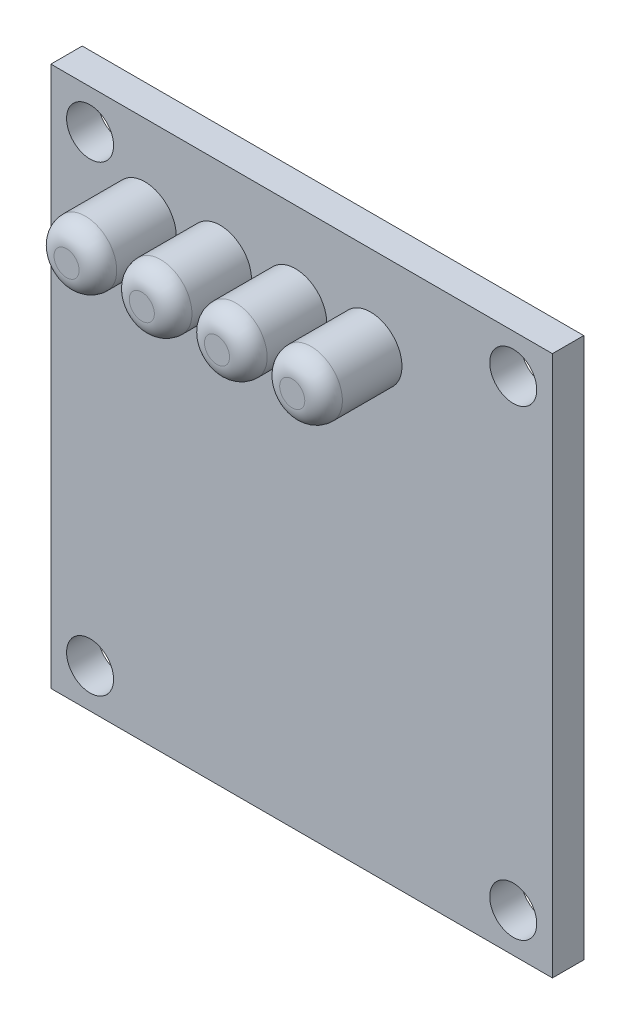
ISO-10303-21;
HEADER;
FILE_DESCRIPTION(('STEP AP214'),'2;1');
FILE_NAME('part.step','',(''),(''),'','','');
FILE_SCHEMA(('AUTOMOTIVE_DESIGN { 1 0 10303 214 1 1 1 1 }'));
ENDSEC;
DATA;
#1=APPLICATION_CONTEXT('core data for automotive mechanical design processes');
#2=APPLICATION_PROTOCOL_DEFINITION('international standard','automotive_design',2000,#1);
#3=PRODUCT_CONTEXT('',#1,'mechanical');
#4=PRODUCT('Part','Part','',(#3));
#5=PRODUCT_RELATED_PRODUCT_CATEGORY('part','',(#4));
#6=PRODUCT_DEFINITION_FORMATION('','',#4);
#7=PRODUCT_DEFINITION_CONTEXT('part definition',#1,'design');
#8=PRODUCT_DEFINITION('design','',#6,#7);
#9=PRODUCT_DEFINITION_SHAPE('','',#8);
#10=(LENGTH_UNIT() NAMED_UNIT(*) SI_UNIT(.MILLI.,.METRE.));
#11=(NAMED_UNIT(*) PLANE_ANGLE_UNIT() SI_UNIT($,.RADIAN.));
#12=(NAMED_UNIT(*) SI_UNIT($,.STERADIAN.) SOLID_ANGLE_UNIT());
#13=UNCERTAINTY_MEASURE_WITH_UNIT(LENGTH_MEASURE(1.E-05),#10,'distance_accuracy_value','');
#14=(GEOMETRIC_REPRESENTATION_CONTEXT(3) GLOBAL_UNCERTAINTY_ASSIGNED_CONTEXT((#13)) GLOBAL_UNIT_ASSIGNED_CONTEXT((#10,
#11,#12)) REPRESENTATION_CONTEXT('',''));
#15=CARTESIAN_POINT('',(0.,0.,0.));
#16=DIRECTION('',(0.,0.,1.));
#17=DIRECTION('',(1.,0.,0.));
#18=AXIS2_PLACEMENT_3D('',#15,#16,#17);
#19=CARTESIAN_POINT('',(0.,0.,2.));
#20=DIRECTION('',(0.,0.,1.));
#21=DIRECTION('',(1.,0.,0.));
#22=AXIS2_PLACEMENT_3D('',#19,#20,#21);
#23=PLANE('',#22);
#24=CARTESIAN_POINT('',(4.4,11.75,2.));
#25=DIRECTION('',(0.,0.,1.));
#26=DIRECTION('',(1.,0.,0.));
#27=AXIS2_PLACEMENT_3D('',#24,#25,#26);
#28=CIRCLE('',#27,2.);
#29=CARTESIAN_POINT('',(6.4,11.75,2.));
#30=VERTEX_POINT('',#29);
#31=EDGE_CURVE('E272',#30,#30,#28,.T.);
#32=ORIENTED_EDGE('',*,*,#31,.F.);
#33=EDGE_LOOP('',(#32));
#34=FACE_BOUND('',#33,.T.);
#35=CARTESIAN_POINT('',(-0.400000000000003,11.75,2.));
#36=DIRECTION('',(0.,0.,1.));
#37=DIRECTION('',(1.,0.,0.));
#38=AXIS2_PLACEMENT_3D('',#35,#36,#37);
#39=CIRCLE('',#38,2.);
#40=CARTESIAN_POINT('',(1.6,11.75,2.));
#41=VERTEX_POINT('',#40);
#42=EDGE_CURVE('E269',#41,#41,#39,.T.);
#43=ORIENTED_EDGE('',*,*,#42,.F.);
#44=EDGE_LOOP('',(#43));
#45=FACE_BOUND('',#44,.T.);
#46=CARTESIAN_POINT('',(-5.2,11.75,2.));
#47=DIRECTION('',(0.,0.,1.));
#48=DIRECTION('',(1.,0.,0.));
#49=AXIS2_PLACEMENT_3D('',#46,#47,#48);
#50=CIRCLE('',#49,2.);
#51=CARTESIAN_POINT('',(-3.2,11.75,2.));
#52=VERTEX_POINT('',#51);
#53=EDGE_CURVE('E264',#52,#52,#50,.T.);
#54=ORIENTED_EDGE('',*,*,#53,.F.);
#55=EDGE_LOOP('',(#54));
#56=FACE_BOUND('',#55,.T.);
#57=CARTESIAN_POINT('',(-10.,11.75,2.));
#58=DIRECTION('',(0.,0.,1.));
#59=DIRECTION('',(1.,0.,0.));
#60=AXIS2_PLACEMENT_3D('',#57,#58,#59);
#61=CIRCLE('',#60,2.);
#62=CARTESIAN_POINT('',(-8.,11.75,2.));
#63=VERTEX_POINT('',#62);
#64=EDGE_CURVE('E259',#63,#63,#61,.T.);
#65=ORIENTED_EDGE('',*,*,#64,.F.);
#66=EDGE_LOOP('',(#65));
#67=FACE_BOUND('',#66,.T.);
#68=CARTESIAN_POINT('',(-13.5,-14.75,2.));
#69=DIRECTION('',(0.,0.,1.));
#70=DIRECTION('',(1.,0.,0.));
#71=AXIS2_PLACEMENT_3D('',#68,#69,#70);
#72=CIRCLE('',#71,1.5);
#73=CARTESIAN_POINT('',(-12.,-14.75,2.));
#74=VERTEX_POINT('',#73);
#75=EDGE_CURVE('E235',#74,#74,#72,.T.);
#76=ORIENTED_EDGE('',*,*,#75,.F.);
#77=EDGE_LOOP('',(#76));
#78=FACE_BOUND('',#77,.T.);
#79=CARTESIAN_POINT('',(-13.5,14.75,2.));
#80=DIRECTION('',(0.,0.,1.));
#81=DIRECTION('',(1.,0.,0.));
#82=AXIS2_PLACEMENT_3D('',#79,#80,#81);
#83=CIRCLE('',#82,1.5);
#84=CARTESIAN_POINT('',(-12.,14.75,2.));
#85=VERTEX_POINT('',#84);
#86=EDGE_CURVE('E107',#85,#85,#83,.T.);
#87=ORIENTED_EDGE('',*,*,#86,.F.);
#88=EDGE_LOOP('',(#87));
#89=FACE_BOUND('',#88,.T.);
#90=DIRECTION('',(0.,-1.,0.));
#91=VECTOR('',#90,1.);
#92=CARTESIAN_POINT('',(-16.,-17.25,2.));
#93=LINE('',#92,#91);
#94=CARTESIAN_POINT('',(-16.,17.25,2.));
#95=VERTEX_POINT('',#94);
#96=CARTESIAN_POINT('',(-16.,-17.25,2.));
#97=VERTEX_POINT('',#96);
#98=EDGE_CURVE('E89',#95,#97,#93,.T.);
#99=ORIENTED_EDGE('',*,*,#98,.T.);
#100=DIRECTION('',(1.,0.,0.));
#101=VECTOR('',#100,1.);
#102=CARTESIAN_POINT('',(16.,-17.25,2.));
#103=LINE('',#102,#101);
#104=CARTESIAN_POINT('',(16.,-17.25,2.));
#105=VERTEX_POINT('',#104);
#106=EDGE_CURVE('E84',#97,#105,#103,.T.);
#107=ORIENTED_EDGE('',*,*,#106,.T.);
#108=DIRECTION('',(0.,1.,0.));
#109=VECTOR('',#108,1.);
#110=CARTESIAN_POINT('',(16.,-17.25,2.));
#111=LINE('',#110,#109);
#112=CARTESIAN_POINT('',(16.,17.25,2.));
#113=VERTEX_POINT('',#112);
#114=EDGE_CURVE('E87',#105,#113,#111,.T.);
#115=ORIENTED_EDGE('',*,*,#114,.T.);
#116=DIRECTION('',(-1.,0.,0.));
#117=VECTOR('',#116,1.);
#118=CARTESIAN_POINT('',(16.,17.25,2.));
#119=LINE('',#118,#117);
#120=EDGE_CURVE('E53',#113,#95,#119,.T.);
#121=ORIENTED_EDGE('',*,*,#120,.T.);
#122=EDGE_LOOP('',(#99,#107,#115,#121));
#123=FACE_BOUND('',#122,.T.);
#124=CARTESIAN_POINT('',(13.5,14.75,2.));
#125=DIRECTION('',(0.,0.,1.));
#126=DIRECTION('',(1.,0.,0.));
#127=AXIS2_PLACEMENT_3D('',#124,#125,#126);
#128=CIRCLE('',#127,1.5);
#129=CARTESIAN_POINT('',(15.,14.75,2.));
#130=VERTEX_POINT('',#129);
#131=EDGE_CURVE('E230',#130,#130,#128,.T.);
#132=ORIENTED_EDGE('',*,*,#131,.F.);
#133=EDGE_LOOP('',(#132));
#134=FACE_BOUND('',#133,.T.);
#135=CARTESIAN_POINT('',(13.5,-14.75,2.));
#136=DIRECTION('',(0.,0.,1.));
#137=DIRECTION('',(1.,0.,0.));
#138=AXIS2_PLACEMENT_3D('',#135,#136,#137);
#139=CIRCLE('',#138,1.5);
#140=CARTESIAN_POINT('',(15.,-14.75,2.));
#141=VERTEX_POINT('',#140);
#142=EDGE_CURVE('E258',#141,#141,#139,.T.);
#143=ORIENTED_EDGE('',*,*,#142,.F.);
#144=EDGE_LOOP('',(#143));
#145=FACE_BOUND('',#144,.T.);
#146=ADVANCED_FACE('F36',(#34,#45,#56,#67,#78,#89,#123,#134,#145),#23,.T.);
#147=CARTESIAN_POINT('',(0.,0.,0.));
#148=DIRECTION('',(0.,0.,1.));
#149=DIRECTION('',(1.,0.,0.));
#150=AXIS2_PLACEMENT_3D('',#147,#148,#149);
#151=PLANE('',#150);
#152=DIRECTION('',(0.,-1.,0.));
#153=VECTOR('',#152,1.);
#154=CARTESIAN_POINT('',(-16.,-17.25,0.));
#155=LINE('',#154,#153);
#156=CARTESIAN_POINT('',(-16.,17.25,0.));
#157=VERTEX_POINT('',#156);
#158=CARTESIAN_POINT('',(-16.,-17.25,0.));
#159=VERTEX_POINT('',#158);
#160=EDGE_CURVE('E104',#157,#159,#155,.T.);
#161=ORIENTED_EDGE('',*,*,#160,.F.);
#162=DIRECTION('',(-1.,0.,0.));
#163=VECTOR('',#162,1.);
#164=CARTESIAN_POINT('',(16.,17.25,0.));
#165=LINE('',#164,#163);
#166=CARTESIAN_POINT('',(16.,17.25,0.));
#167=VERTEX_POINT('',#166);
#168=EDGE_CURVE('E76',#167,#157,#165,.T.);
#169=ORIENTED_EDGE('',*,*,#168,.F.);
#170=DIRECTION('',(0.,1.,0.));
#171=VECTOR('',#170,1.);
#172=CARTESIAN_POINT('',(16.,-17.25,0.));
#173=LINE('',#172,#171);
#174=CARTESIAN_POINT('',(16.,-17.25,0.));
#175=VERTEX_POINT('',#174);
#176=EDGE_CURVE('E70',#175,#167,#173,.T.);
#177=ORIENTED_EDGE('',*,*,#176,.F.);
#178=DIRECTION('',(1.,0.,0.));
#179=VECTOR('',#178,1.);
#180=CARTESIAN_POINT('',(16.,-17.25,0.));
#181=LINE('',#180,#179);
#182=EDGE_CURVE('E94',#159,#175,#181,.T.);
#183=ORIENTED_EDGE('',*,*,#182,.F.);
#184=EDGE_LOOP('',(#161,#169,#177,#183));
#185=FACE_BOUND('',#184,.T.);
#186=CARTESIAN_POINT('',(-13.5,14.75,0.));
#187=DIRECTION('',(0.,0.,1.));
#188=DIRECTION('',(1.,0.,0.));
#189=AXIS2_PLACEMENT_3D('',#186,#187,#188);
#190=CIRCLE('',#189,1.5);
#191=CARTESIAN_POINT('',(-12.,14.75,0.));
#192=VERTEX_POINT('',#191);
#193=EDGE_CURVE('E237',#192,#192,#190,.T.);
#194=ORIENTED_EDGE('',*,*,#193,.T.);
#195=EDGE_LOOP('',(#194));
#196=FACE_BOUND('',#195,.T.);
#197=CARTESIAN_POINT('',(13.5,14.75,0.));
#198=DIRECTION('',(0.,0.,1.));
#199=DIRECTION('',(1.,0.,0.));
#200=AXIS2_PLACEMENT_3D('',#197,#198,#199);
#201=CIRCLE('',#200,1.5);
#202=CARTESIAN_POINT('',(15.,14.75,0.));
#203=VERTEX_POINT('',#202);
#204=EDGE_CURVE('E233',#203,#203,#201,.T.);
#205=ORIENTED_EDGE('',*,*,#204,.T.);
#206=EDGE_LOOP('',(#205));
#207=FACE_BOUND('',#206,.T.);
#208=CARTESIAN_POINT('',(-13.5,-14.75,0.));
#209=DIRECTION('',(0.,0.,1.));
#210=DIRECTION('',(1.,0.,0.));
#211=AXIS2_PLACEMENT_3D('',#208,#209,#210);
#212=CIRCLE('',#211,1.5);
#213=CARTESIAN_POINT('',(-12.,-14.75,0.));
#214=VERTEX_POINT('',#213);
#215=EDGE_CURVE('E240',#214,#214,#212,.T.);
#216=ORIENTED_EDGE('',*,*,#215,.T.);
#217=EDGE_LOOP('',(#216));
#218=FACE_BOUND('',#217,.T.);
#219=CARTESIAN_POINT('',(13.5,-14.75,0.));
#220=DIRECTION('',(0.,0.,1.));
#221=DIRECTION('',(1.,0.,0.));
#222=AXIS2_PLACEMENT_3D('',#219,#220,#221);
#223=CIRCLE('',#222,1.5);
#224=CARTESIAN_POINT('',(15.,-14.75,0.));
#225=VERTEX_POINT('',#224);
#226=EDGE_CURVE('E256',#225,#225,#223,.T.);
#227=ORIENTED_EDGE('',*,*,#226,.T.);
#228=EDGE_LOOP('',(#227));
#229=FACE_BOUND('',#228,.T.);
#230=ADVANCED_FACE('F146',(#185,#196,#207,#218,#229),#151,.F.);
#231=CARTESIAN_POINT('',(-16.,-17.25,2.));
#232=DIRECTION('',(1.,0.,0.));
#233=DIRECTION('',(0.,0.,-1.));
#234=AXIS2_PLACEMENT_3D('',#231,#232,#233);
#235=PLANE('',#234);
#236=ORIENTED_EDGE('',*,*,#160,.T.);
#237=DIRECTION('',(0.,0.,-1.));
#238=VECTOR('',#237,1.);
#239=CARTESIAN_POINT('',(-16.,-17.25,2.));
#240=LINE('',#239,#238);
#241=EDGE_CURVE('E95',#97,#159,#240,.T.);
#242=ORIENTED_EDGE('',*,*,#241,.F.);
#243=ORIENTED_EDGE('',*,*,#98,.F.);
#244=DIRECTION('',(0.,0.,-1.));
#245=VECTOR('',#244,1.);
#246=CARTESIAN_POINT('',(-16.,17.25,2.));
#247=LINE('',#246,#245);
#248=EDGE_CURVE('E100',#95,#157,#247,.T.);
#249=ORIENTED_EDGE('',*,*,#248,.T.);
#250=EDGE_LOOP('',(#236,#242,#243,#249));
#251=FACE_BOUND('',#250,.T.);
#252=ADVANCED_FACE('F152',(#251),#235,.F.);
#253=CARTESIAN_POINT('',(16.,-17.25,2.));
#254=DIRECTION('',(0.,1.,0.));
#255=DIRECTION('',(0.,0.,1.));
#256=AXIS2_PLACEMENT_3D('',#253,#254,#255);
#257=PLANE('',#256);
#258=ORIENTED_EDGE('',*,*,#182,.T.);
#259=DIRECTION('',(0.,0.,-1.));
#260=VECTOR('',#259,1.);
#261=CARTESIAN_POINT('',(16.,-17.25,2.));
#262=LINE('',#261,#260);
#263=EDGE_CURVE('E92',#105,#175,#262,.T.);
#264=ORIENTED_EDGE('',*,*,#263,.F.);
#265=ORIENTED_EDGE('',*,*,#106,.F.);
#266=ORIENTED_EDGE('',*,*,#241,.T.);
#267=EDGE_LOOP('',(#258,#264,#265,#266));
#268=FACE_BOUND('',#267,.T.);
#269=ADVANCED_FACE('F93',(#268),#257,.F.);
#270=CARTESIAN_POINT('',(16.,-17.25,2.));
#271=DIRECTION('',(-1.,0.,0.));
#272=DIRECTION('',(0.,0.,1.));
#273=AXIS2_PLACEMENT_3D('',#270,#271,#272);
#274=PLANE('',#273);
#275=ORIENTED_EDGE('',*,*,#176,.T.);
#276=DIRECTION('',(0.,0.,-1.));
#277=VECTOR('',#276,1.);
#278=CARTESIAN_POINT('',(16.,17.25,2.));
#279=LINE('',#278,#277);
#280=EDGE_CURVE('E96',#113,#167,#279,.T.);
#281=ORIENTED_EDGE('',*,*,#280,.F.);
#282=ORIENTED_EDGE('',*,*,#114,.F.);
#283=ORIENTED_EDGE('',*,*,#263,.T.);
#284=EDGE_LOOP('',(#275,#281,#282,#283));
#285=FACE_BOUND('',#284,.T.);
#286=ADVANCED_FACE('F98',(#285),#274,.F.);
#287=CARTESIAN_POINT('',(16.,17.25,2.));
#288=DIRECTION('',(0.,-1.,0.));
#289=DIRECTION('',(1.,0.,0.));
#290=AXIS2_PLACEMENT_3D('',#287,#288,#289);
#291=PLANE('',#290);
#292=ORIENTED_EDGE('',*,*,#168,.T.);
#293=ORIENTED_EDGE('',*,*,#248,.F.);
#294=ORIENTED_EDGE('',*,*,#120,.F.);
#295=ORIENTED_EDGE('',*,*,#280,.T.);
#296=EDGE_LOOP('',(#292,#293,#294,#295));
#297=FACE_BOUND('',#296,.T.);
#298=ADVANCED_FACE('F161',(#297),#291,.F.);
#299=CARTESIAN_POINT('',(-13.5,14.75,2.));
#300=DIRECTION('',(0.,0.,-1.));
#301=DIRECTION('',(-1.,0.,0.));
#302=AXIS2_PLACEMENT_3D('',#299,#300,#301);
#303=CYLINDRICAL_SURFACE('',#302,1.5);
#304=ORIENTED_EDGE('',*,*,#86,.T.);
#305=EDGE_LOOP('',(#304));
#306=FACE_BOUND('',#305,.T.);
#307=ORIENTED_EDGE('',*,*,#193,.F.);
#308=EDGE_LOOP('',(#307));
#309=FACE_BOUND('',#308,.T.);
#310=ADVANCED_FACE('F158',(#306,#309),#303,.F.);
#311=CARTESIAN_POINT('',(13.5,14.75,2.));
#312=DIRECTION('',(0.,0.,-1.));
#313=DIRECTION('',(-1.,0.,0.));
#314=AXIS2_PLACEMENT_3D('',#311,#312,#313);
#315=CYLINDRICAL_SURFACE('',#314,1.5);
#316=ORIENTED_EDGE('',*,*,#131,.T.);
#317=EDGE_LOOP('',(#316));
#318=FACE_BOUND('',#317,.T.);
#319=ORIENTED_EDGE('',*,*,#204,.F.);
#320=EDGE_LOOP('',(#319));
#321=FACE_BOUND('',#320,.T.);
#322=ADVANCED_FACE('F219',(#318,#321),#315,.F.);
#323=CARTESIAN_POINT('',(-13.5,-14.75,2.));
#324=DIRECTION('',(0.,0.,-1.));
#325=DIRECTION('',(-1.,0.,0.));
#326=AXIS2_PLACEMENT_3D('',#323,#324,#325);
#327=CYLINDRICAL_SURFACE('',#326,1.5);
#328=ORIENTED_EDGE('',*,*,#75,.T.);
#329=EDGE_LOOP('',(#328));
#330=FACE_BOUND('',#329,.T.);
#331=ORIENTED_EDGE('',*,*,#215,.F.);
#332=EDGE_LOOP('',(#331));
#333=FACE_BOUND('',#332,.T.);
#334=ADVANCED_FACE('F216',(#330,#333),#327,.F.);
#335=CARTESIAN_POINT('',(13.5,-14.75,2.));
#336=DIRECTION('',(0.,0.,-1.));
#337=DIRECTION('',(-1.,0.,0.));
#338=AXIS2_PLACEMENT_3D('',#335,#336,#337);
#339=CYLINDRICAL_SURFACE('',#338,1.5);
#340=ORIENTED_EDGE('',*,*,#142,.T.);
#341=EDGE_LOOP('',(#340));
#342=FACE_BOUND('',#341,.T.);
#343=ORIENTED_EDGE('',*,*,#226,.F.);
#344=EDGE_LOOP('',(#343));
#345=FACE_BOUND('',#344,.T.);
#346=ADVANCED_FACE('F212',(#342,#345),#339,.F.);
#347=CARTESIAN_POINT('',(-10.,11.75,7.));
#348=DIRECTION('',(0.,0.,-1.));
#349=DIRECTION('',(-1.,0.,0.));
#350=AXIS2_PLACEMENT_3D('',#347,#348,#349);
#351=CYLINDRICAL_SURFACE('',#350,2.);
#352=CARTESIAN_POINT('',(-10.,11.75,5.8));
#353=DIRECTION('',(0.,0.,1.));
#354=DIRECTION('',(1.,0.,0.));
#355=AXIS2_PLACEMENT_3D('',#352,#353,#354);
#356=CIRCLE('',#355,2.);
#357=CARTESIAN_POINT('',(-8.,11.75,5.8));
#358=VERTEX_POINT('',#357);
#359=EDGE_CURVE('E11',#358,#358,#356,.F.);
#360=ORIENTED_EDGE('',*,*,#359,.T.);
#361=EDGE_LOOP('',(#360));
#362=FACE_BOUND('',#361,.T.);
#363=ORIENTED_EDGE('',*,*,#64,.T.);
#364=EDGE_LOOP('',(#363));
#365=FACE_BOUND('',#364,.T.);
#366=ADVANCED_FACE('F209',(#362,#365),#351,.T.);
#367=CARTESIAN_POINT('',(-10.,11.75,7.));
#368=DIRECTION('',(0.,0.,1.));
#369=DIRECTION('',(1.,0.,0.));
#370=AXIS2_PLACEMENT_3D('',#367,#368,#369);
#371=PLANE('',#370);
#372=CARTESIAN_POINT('',(-10.,11.75,7.));
#373=DIRECTION('',(0.,0.,1.));
#374=DIRECTION('',(1.,0.,0.));
#375=AXIS2_PLACEMENT_3D('',#372,#373,#374);
#376=CIRCLE('',#375,0.8);
#377=CARTESIAN_POINT('',(-9.2,11.75,7.));
#378=VERTEX_POINT('',#377);
#379=EDGE_CURVE('E45',#378,#378,#376,.T.);
#380=ORIENTED_EDGE('',*,*,#379,.T.);
#381=EDGE_LOOP('',(#380));
#382=FACE_BOUND('',#381,.T.);
#383=ADVANCED_FACE('F134',(#382),#371,.T.);
#384=CARTESIAN_POINT('',(-5.2,11.75,7.));
#385=DIRECTION('',(0.,0.,-1.));
#386=DIRECTION('',(-1.,0.,0.));
#387=AXIS2_PLACEMENT_3D('',#384,#385,#386);
#388=CYLINDRICAL_SURFACE('',#387,2.);
#389=CARTESIAN_POINT('',(-5.2,11.75,5.8));
#390=DIRECTION('',(0.,0.,1.));
#391=DIRECTION('',(1.,0.,0.));
#392=AXIS2_PLACEMENT_3D('',#389,#390,#391);
#393=CIRCLE('',#392,2.);
#394=CARTESIAN_POINT('',(-3.2,11.75,5.8));
#395=VERTEX_POINT('',#394);
#396=EDGE_CURVE('E129',#395,#395,#393,.F.);
#397=ORIENTED_EDGE('',*,*,#396,.T.);
#398=EDGE_LOOP('',(#397));
#399=FACE_BOUND('',#398,.T.);
#400=ORIENTED_EDGE('',*,*,#53,.T.);
#401=EDGE_LOOP('',(#400));
#402=FACE_BOUND('',#401,.T.);
#403=ADVANCED_FACE('F202',(#399,#402),#388,.T.);
#404=CARTESIAN_POINT('',(-5.2,11.75,7.));
#405=DIRECTION('',(0.,0.,1.));
#406=DIRECTION('',(1.,0.,0.));
#407=AXIS2_PLACEMENT_3D('',#404,#405,#406);
#408=PLANE('',#407);
#409=CARTESIAN_POINT('',(-5.2,11.75,7.));
#410=DIRECTION('',(0.,0.,1.));
#411=DIRECTION('',(1.,0.,0.));
#412=AXIS2_PLACEMENT_3D('',#409,#410,#411);
#413=CIRCLE('',#412,0.8);
#414=CARTESIAN_POINT('',(-4.4,11.75,7.));
#415=VERTEX_POINT('',#414);
#416=EDGE_CURVE('E126',#415,#415,#413,.T.);
#417=ORIENTED_EDGE('',*,*,#416,.T.);
#418=EDGE_LOOP('',(#417));
#419=FACE_BOUND('',#418,.T.);
#420=ADVANCED_FACE('F195',(#419),#408,.T.);
#421=CARTESIAN_POINT('',(-0.400000000000003,11.75,7.));
#422=DIRECTION('',(0.,0.,-1.));
#423=DIRECTION('',(-1.,0.,0.));
#424=AXIS2_PLACEMENT_3D('',#421,#422,#423);
#425=CYLINDRICAL_SURFACE('',#424,2.);
#426=CARTESIAN_POINT('',(-0.400000000000003,11.75,5.8));
#427=DIRECTION('',(0.,0.,1.));
#428=DIRECTION('',(1.,0.,0.));
#429=AXIS2_PLACEMENT_3D('',#426,#427,#428);
#430=CIRCLE('',#429,2.);
#431=CARTESIAN_POINT('',(1.6,11.75,5.8));
#432=VERTEX_POINT('',#431);
#433=EDGE_CURVE('E123',#432,#432,#430,.F.);
#434=ORIENTED_EDGE('',*,*,#433,.T.);
#435=EDGE_LOOP('',(#434));
#436=FACE_BOUND('',#435,.T.);
#437=ORIENTED_EDGE('',*,*,#42,.T.);
#438=EDGE_LOOP('',(#437));
#439=FACE_BOUND('',#438,.T.);
#440=ADVANCED_FACE('F187',(#436,#439),#425,.T.);
#441=CARTESIAN_POINT('',(-0.400000000000003,11.75,7.));
#442=DIRECTION('',(0.,0.,1.));
#443=DIRECTION('',(1.,0.,0.));
#444=AXIS2_PLACEMENT_3D('',#441,#442,#443);
#445=PLANE('',#444);
#446=CARTESIAN_POINT('',(-0.400000000000003,11.75,7.));
#447=DIRECTION('',(0.,0.,1.));
#448=DIRECTION('',(1.,0.,0.));
#449=AXIS2_PLACEMENT_3D('',#446,#447,#448);
#450=CIRCLE('',#449,0.8);
#451=CARTESIAN_POINT('',(0.399999999999997,11.75,7.));
#452=VERTEX_POINT('',#451);
#453=EDGE_CURVE('E120',#452,#452,#450,.T.);
#454=ORIENTED_EDGE('',*,*,#453,.T.);
#455=EDGE_LOOP('',(#454));
#456=FACE_BOUND('',#455,.T.);
#457=ADVANCED_FACE('F184',(#456),#445,.T.);
#458=CARTESIAN_POINT('',(4.4,11.75,7.));
#459=DIRECTION('',(0.,0.,-1.));
#460=DIRECTION('',(-1.,0.,0.));
#461=AXIS2_PLACEMENT_3D('',#458,#459,#460);
#462=CYLINDRICAL_SURFACE('',#461,2.);
#463=CARTESIAN_POINT('',(4.4,11.75,5.8));
#464=DIRECTION('',(0.,0.,1.));
#465=DIRECTION('',(1.,0.,0.));
#466=AXIS2_PLACEMENT_3D('',#463,#464,#465);
#467=CIRCLE('',#466,2.);
#468=CARTESIAN_POINT('',(6.4,11.75,5.8));
#469=VERTEX_POINT('',#468);
#470=EDGE_CURVE('E117',#469,#469,#467,.F.);
#471=ORIENTED_EDGE('',*,*,#470,.T.);
#472=EDGE_LOOP('',(#471));
#473=FACE_BOUND('',#472,.T.);
#474=ORIENTED_EDGE('',*,*,#31,.T.);
#475=EDGE_LOOP('',(#474));
#476=FACE_BOUND('',#475,.T.);
#477=ADVANCED_FACE('F186',(#473,#476),#462,.T.);
#478=CARTESIAN_POINT('',(4.4,11.75,7.));
#479=DIRECTION('',(0.,0.,1.));
#480=DIRECTION('',(1.,0.,0.));
#481=AXIS2_PLACEMENT_3D('',#478,#479,#480);
#482=PLANE('',#481);
#483=CARTESIAN_POINT('',(4.4,11.75,7.));
#484=DIRECTION('',(0.,0.,1.));
#485=DIRECTION('',(1.,0.,0.));
#486=AXIS2_PLACEMENT_3D('',#483,#484,#485);
#487=CIRCLE('',#486,0.8);
#488=CARTESIAN_POINT('',(5.2,11.75,7.));
#489=VERTEX_POINT('',#488);
#490=EDGE_CURVE('E114',#489,#489,#487,.T.);
#491=ORIENTED_EDGE('',*,*,#490,.T.);
#492=EDGE_LOOP('',(#491));
#493=FACE_BOUND('',#492,.T.);
#494=ADVANCED_FACE('F174',(#493),#482,.T.);
#495=CARTESIAN_POINT('',(4.4,11.75,5.8));
#496=DIRECTION('',(0.,0.,1.));
#497=DIRECTION('',(1.,0.,0.));
#498=AXIS2_PLACEMENT_3D('',#495,#496,#497);
#499=DEGENERATE_TOROIDAL_SURFACE('',#498,0.8,1.2,.T.);
#500=ORIENTED_EDGE('',*,*,#470,.F.);
#501=EDGE_LOOP('',(#500));
#502=FACE_BOUND('',#501,.T.);
#503=ORIENTED_EDGE('',*,*,#490,.F.);
#504=EDGE_LOOP('',(#503));
#505=FACE_BOUND('',#504,.T.);
#506=ADVANCED_FACE('F171',(#502,#505),#499,.T.);
#507=CARTESIAN_POINT('',(-0.400000000000003,11.75,5.8));
#508=DIRECTION('',(0.,0.,1.));
#509=DIRECTION('',(1.,0.,0.));
#510=AXIS2_PLACEMENT_3D('',#507,#508,#509);
#511=DEGENERATE_TOROIDAL_SURFACE('',#510,0.8,1.2,.T.);
#512=ORIENTED_EDGE('',*,*,#433,.F.);
#513=EDGE_LOOP('',(#512));
#514=FACE_BOUND('',#513,.T.);
#515=ORIENTED_EDGE('',*,*,#453,.F.);
#516=EDGE_LOOP('',(#515));
#517=FACE_BOUND('',#516,.T.);
#518=ADVANCED_FACE('F142',(#514,#517),#511,.T.);
#519=CARTESIAN_POINT('',(-5.2,11.75,5.8));
#520=DIRECTION('',(0.,0.,1.));
#521=DIRECTION('',(1.,0.,0.));
#522=AXIS2_PLACEMENT_3D('',#519,#520,#521);
#523=DEGENERATE_TOROIDAL_SURFACE('',#522,0.8,1.2,.T.);
#524=ORIENTED_EDGE('',*,*,#396,.F.);
#525=EDGE_LOOP('',(#524));
#526=FACE_BOUND('',#525,.T.);
#527=ORIENTED_EDGE('',*,*,#416,.F.);
#528=EDGE_LOOP('',(#527));
#529=FACE_BOUND('',#528,.T.);
#530=ADVANCED_FACE('F137',(#526,#529),#523,.T.);
#531=CARTESIAN_POINT('',(-10.,11.75,5.8));
#532=DIRECTION('',(0.,0.,1.));
#533=DIRECTION('',(1.,0.,0.));
#534=AXIS2_PLACEMENT_3D('',#531,#532,#533);
#535=DEGENERATE_TOROIDAL_SURFACE('',#534,0.8,1.2,.T.);
#536=ORIENTED_EDGE('',*,*,#359,.F.);
#537=EDGE_LOOP('',(#536));
#538=FACE_BOUND('',#537,.T.);
#539=ORIENTED_EDGE('',*,*,#379,.F.);
#540=EDGE_LOOP('',(#539));
#541=FACE_BOUND('',#540,.T.);
#542=ADVANCED_FACE('F38',(#538,#541),#535,.T.);
#543=CLOSED_SHELL('',(#146,#230,#252,#269,#286,#298,#310,#322,#334,#346,#366,#383,#403,#420,
#440,#457,#477,#494,#506,#518,#530,#542));
#544=MANIFOLD_SOLID_BREP('B2',#543);
#545=ADVANCED_BREP_SHAPE_REPRESENTATION('',(#18,#544),#14);
#546=SHAPE_DEFINITION_REPRESENTATION(#9,#545);
ENDSEC;
END-ISO-10303-21;
